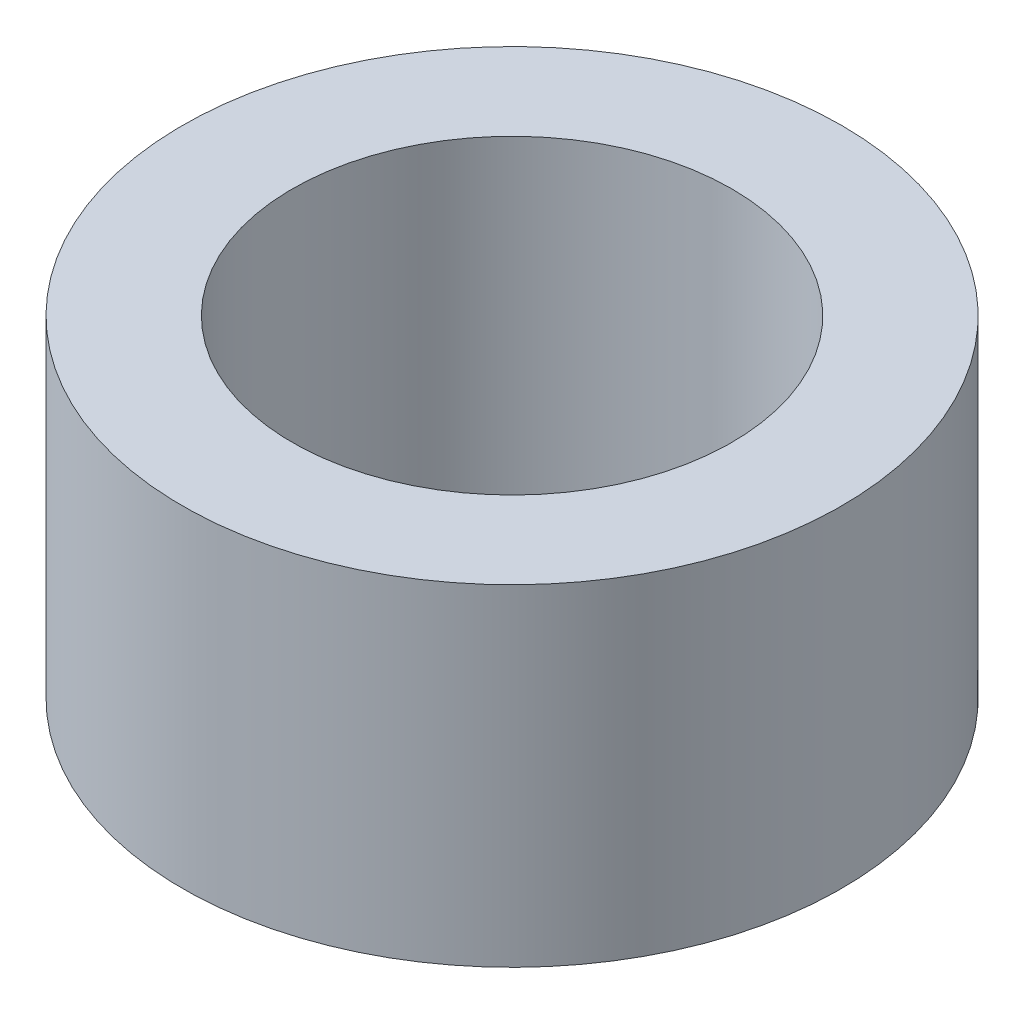
ISO-10303-21;
HEADER;
FILE_DESCRIPTION(('STEP AP214'),'2;1');
FILE_NAME('part.step','',(''),(''),'','','');
FILE_SCHEMA(('AUTOMOTIVE_DESIGN { 1 0 10303 214 1 1 1 1 }'));
ENDSEC;
DATA;
#1=APPLICATION_CONTEXT('core data for automotive mechanical design processes');
#2=APPLICATION_PROTOCOL_DEFINITION('international standard','automotive_design',2000,#1);
#3=PRODUCT_CONTEXT('',#1,'mechanical');
#4=PRODUCT('Part','Part','',(#3));
#5=PRODUCT_RELATED_PRODUCT_CATEGORY('part','',(#4));
#6=PRODUCT_DEFINITION_FORMATION('','',#4);
#7=PRODUCT_DEFINITION_CONTEXT('part definition',#1,'design');
#8=PRODUCT_DEFINITION('design','',#6,#7);
#9=PRODUCT_DEFINITION_SHAPE('','',#8);
#10=(LENGTH_UNIT() NAMED_UNIT(*) SI_UNIT(.MILLI.,.METRE.));
#11=(NAMED_UNIT(*) PLANE_ANGLE_UNIT() SI_UNIT($,.RADIAN.));
#12=(NAMED_UNIT(*) SI_UNIT($,.STERADIAN.) SOLID_ANGLE_UNIT());
#13=UNCERTAINTY_MEASURE_WITH_UNIT(LENGTH_MEASURE(1.E-05),#10,'distance_accuracy_value','');
#14=(GEOMETRIC_REPRESENTATION_CONTEXT(3) GLOBAL_UNCERTAINTY_ASSIGNED_CONTEXT((#13)) GLOBAL_UNIT_ASSIGNED_CONTEXT((#10,
#11,#12)) REPRESENTATION_CONTEXT('',''));
#15=CARTESIAN_POINT('',(0.,0.,0.));
#16=DIRECTION('',(0.,0.,1.));
#17=DIRECTION('',(1.,0.,0.));
#18=AXIS2_PLACEMENT_3D('',#15,#16,#17);
#19=CARTESIAN_POINT('',(0.,6.0325,0.));
#20=DIRECTION('',(0.,1.,0.));
#21=DIRECTION('',(0.,0.,1.));
#22=AXIS2_PLACEMENT_3D('',#19,#20,#21);
#23=PLANE('',#22);
#24=CARTESIAN_POINT('',(0.,6.0325,0.));
#25=DIRECTION('',(0.,1.,0.));
#26=DIRECTION('',(0.,0.,1.));
#27=AXIS2_PLACEMENT_3D('',#24,#25,#26);
#28=CIRCLE('',#27,6.);
#29=CARTESIAN_POINT('',(0.,6.0325,-6.));
#30=VERTEX_POINT('',#29);
#31=EDGE_CURVE('E10',#30,#30,#28,.T.);
#32=ORIENTED_EDGE('',*,*,#31,.T.);
#33=EDGE_LOOP('',(#32));
#34=FACE_BOUND('',#33,.T.);
#35=CARTESIAN_POINT('',(0.,6.0325,0.));
#36=DIRECTION('',(0.,1.,0.));
#37=DIRECTION('',(0.,0.,1.));
#38=AXIS2_PLACEMENT_3D('',#35,#36,#37);
#39=CIRCLE('',#38,4.);
#40=CARTESIAN_POINT('',(0.,6.0325,-4.));
#41=VERTEX_POINT('',#40);
#42=EDGE_CURVE('E42',#41,#41,#39,.T.);
#43=ORIENTED_EDGE('',*,*,#42,.F.);
#44=EDGE_LOOP('',(#43));
#45=FACE_BOUND('',#44,.T.);
#46=ADVANCED_FACE('F31',(#34,#45),#23,.T.);
#47=CARTESIAN_POINT('',(0.,0.,0.));
#48=DIRECTION('',(0.,1.,0.));
#49=DIRECTION('',(0.,0.,1.));
#50=AXIS2_PLACEMENT_3D('',#47,#48,#49);
#51=PLANE('',#50);
#52=CARTESIAN_POINT('',(0.,0.,0.));
#53=DIRECTION('',(0.,1.,0.));
#54=DIRECTION('',(0.,0.,1.));
#55=AXIS2_PLACEMENT_3D('',#52,#53,#54);
#56=CIRCLE('',#55,6.);
#57=CARTESIAN_POINT('',(0.,0.,-6.));
#58=VERTEX_POINT('',#57);
#59=EDGE_CURVE('E35',#58,#58,#56,.T.);
#60=ORIENTED_EDGE('',*,*,#59,.F.);
#61=EDGE_LOOP('',(#60));
#62=FACE_BOUND('',#61,.T.);
#63=CARTESIAN_POINT('',(0.,0.,0.));
#64=DIRECTION('',(0.,1.,0.));
#65=DIRECTION('',(0.,0.,1.));
#66=AXIS2_PLACEMENT_3D('',#63,#64,#65);
#67=CIRCLE('',#66,4.);
#68=CARTESIAN_POINT('',(0.,0.,-4.));
#69=VERTEX_POINT('',#68);
#70=EDGE_CURVE('E44',#69,#69,#67,.T.);
#71=ORIENTED_EDGE('',*,*,#70,.T.);
#72=EDGE_LOOP('',(#71));
#73=FACE_BOUND('',#72,.T.);
#74=ADVANCED_FACE('F54',(#62,#73),#51,.F.);
#75=CARTESIAN_POINT('',(0.,6.0325,0.));
#76=DIRECTION('',(0.,-1.,0.));
#77=DIRECTION('',(0.,0.,-1.));
#78=AXIS2_PLACEMENT_3D('',#75,#76,#77);
#79=CYLINDRICAL_SURFACE('',#78,6.);
#80=CARTESIAN_POINT('',(0.,6.0325,-6.));
#81=CARTESIAN_POINT('',(0.,5.96966145833333,-6.));
#82=CARTESIAN_POINT('',(0.,5.90682291666667,-6.));
#83=CARTESIAN_POINT('',(0.,5.78114583333333,-6.));
#84=CARTESIAN_POINT('',(0.,5.71830729166667,-6.));
#85=CARTESIAN_POINT('',(0.,5.59263020833333,-6.));
#86=CARTESIAN_POINT('',(0.,5.52979166666667,-6.));
#87=CARTESIAN_POINT('',(0.,5.40411458333333,-6.));
#88=CARTESIAN_POINT('',(0.,5.34127604166667,-6.));
#89=CARTESIAN_POINT('',(0.,5.21559895833333,-6.));
#90=CARTESIAN_POINT('',(0.,5.15276041666667,-6.));
#91=CARTESIAN_POINT('',(0.,5.02708333333333,-6.));
#92=CARTESIAN_POINT('',(0.,4.96424479166667,-6.));
#93=CARTESIAN_POINT('',(0.,4.83856770833333,-6.));
#94=CARTESIAN_POINT('',(0.,4.77572916666667,-6.));
#95=CARTESIAN_POINT('',(0.,4.65005208333333,-6.));
#96=CARTESIAN_POINT('',(0.,4.58721354166667,-6.));
#97=CARTESIAN_POINT('',(0.,4.46153645833333,-6.));
#98=CARTESIAN_POINT('',(0.,4.39869791666667,-6.));
#99=CARTESIAN_POINT('',(0.,4.27302083333333,-6.));
#100=CARTESIAN_POINT('',(0.,4.21018229166667,-6.));
#101=CARTESIAN_POINT('',(0.,4.08450520833333,-6.));
#102=CARTESIAN_POINT('',(0.,4.02166666666667,-6.));
#103=CARTESIAN_POINT('',(0.,3.89598958333333,-6.));
#104=CARTESIAN_POINT('',(0.,3.83315104166667,-6.));
#105=CARTESIAN_POINT('',(0.,3.70747395833333,-6.));
#106=CARTESIAN_POINT('',(0.,3.64463541666667,-6.));
#107=CARTESIAN_POINT('',(0.,3.51895833333333,-6.));
#108=CARTESIAN_POINT('',(0.,3.45611979166667,-6.));
#109=CARTESIAN_POINT('',(0.,3.33044270833333,-6.));
#110=CARTESIAN_POINT('',(0.,3.26760416666667,-6.));
#111=CARTESIAN_POINT('',(0.,3.14192708333333,-6.));
#112=CARTESIAN_POINT('',(0.,3.07908854166667,-6.));
#113=CARTESIAN_POINT('',(0.,2.95341145833333,-6.));
#114=CARTESIAN_POINT('',(0.,2.89057291666667,-6.));
#115=CARTESIAN_POINT('',(0.,2.76489583333333,-6.));
#116=CARTESIAN_POINT('',(0.,2.70205729166667,-6.));
#117=CARTESIAN_POINT('',(0.,2.57638020833333,-6.));
#118=CARTESIAN_POINT('',(0.,2.51354166666667,-6.));
#119=CARTESIAN_POINT('',(0.,2.38786458333333,-6.));
#120=CARTESIAN_POINT('',(0.,2.32502604166667,-6.));
#121=CARTESIAN_POINT('',(0.,2.19934895833333,-6.));
#122=CARTESIAN_POINT('',(0.,2.13651041666667,-6.));
#123=CARTESIAN_POINT('',(0.,2.01083333333333,-6.));
#124=CARTESIAN_POINT('',(0.,1.94799479166667,-6.));
#125=CARTESIAN_POINT('',(0.,1.82231770833333,-6.));
#126=CARTESIAN_POINT('',(0.,1.75947916666667,-6.));
#127=CARTESIAN_POINT('',(0.,1.63380208333333,-6.));
#128=CARTESIAN_POINT('',(0.,1.57096354166667,-6.));
#129=CARTESIAN_POINT('',(0.,1.44528645833333,-6.));
#130=CARTESIAN_POINT('',(0.,1.38244791666667,-6.));
#131=CARTESIAN_POINT('',(0.,1.25677083333333,-6.));
#132=CARTESIAN_POINT('',(0.,1.19393229166667,-6.));
#133=CARTESIAN_POINT('',(0.,1.06825520833333,-6.));
#134=CARTESIAN_POINT('',(0.,1.00541666666667,-6.));
#135=CARTESIAN_POINT('',(0.,0.879739583333333,-6.));
#136=CARTESIAN_POINT('',(0.,0.816901041666666,-6.));
#137=CARTESIAN_POINT('',(0.,0.691223958333333,-6.));
#138=CARTESIAN_POINT('',(0.,0.628385416666666,-6.));
#139=CARTESIAN_POINT('',(0.,0.502708333333332,-6.));
#140=CARTESIAN_POINT('',(0.,0.439869791666666,-6.));
#141=CARTESIAN_POINT('',(0.,0.314192708333332,-6.));
#142=CARTESIAN_POINT('',(0.,0.251354166666666,-6.));
#143=CARTESIAN_POINT('',(0.,0.125677083333332,-6.));
#144=CARTESIAN_POINT('',(0.,0.0628385416666657,-6.));
#145=CARTESIAN_POINT('',(0.,0.,-6.));
#146=B_SPLINE_CURVE_WITH_KNOTS('',3,(#80,#81,#82,#83,#84,#85,#86,#87,#88,#89,#90,#91,#92,#93,
#94,#95,#96,#97,#98,#99,#100,#101,#102,#103,#104,#105,#106,#107,#108,#109,#110,#111,#112,#113,
#114,#115,#116,#117,#118,#119,#120,#121,#122,#123,#124,#125,#126,#127,#128,#129,#130,#131,#132,
#133,#134,#135,#136,#137,#138,#139,#140,#141,#142,#143,#144,#145),.UNSPECIFIED.,.F.,.F.,(4,2,2,
2,2,2,2,2,2,2,2,2,2,2,2,2,2,2,2,2,2,2,2,2,2,2,2,2,2,2,2,2,4),(0.,0.188515625,0.37703125,
0.565546875,0.7540625,0.942578124999999,1.13109375,1.319609375,1.508125,1.696640625,1.88515625,
2.073671875,2.2621875,2.450703125,2.63921875,2.827734375,3.01625,3.204765625,3.39328125,
3.581796875,3.7703125,3.958828125,4.14734375,4.335859375,4.524375,4.712890625,4.90140625,
5.089921875,5.2784375,5.466953125,5.65546875,5.843984375,6.0325),.UNSPECIFIED.);
#147=EDGE_CURVE('BSEAM33',#30,#58,#146,.T.);
#148=ORIENTED_EDGE('',*,*,#31,.F.);
#149=ORIENTED_EDGE('',*,*,#59,.T.);
#150=ORIENTED_EDGE('',*,*,#147,.T.);
#151=ORIENTED_EDGE('',*,*,#147,.F.);
#152=EDGE_LOOP('',(#148,#150,#149,#151));
#153=FACE_BOUND('',#152,.T.);
#154=ADVANCED_FACE('F33',(#153),#79,.T.);
#155=CARTESIAN_POINT('',(0.,6.0325,0.));
#156=DIRECTION('',(0.,-1.,0.));
#157=DIRECTION('',(0.,0.,-1.));
#158=AXIS2_PLACEMENT_3D('',#155,#156,#157);
#159=CYLINDRICAL_SURFACE('',#158,4.);
#160=CARTESIAN_POINT('',(0.,6.0325,-4.));
#161=CARTESIAN_POINT('',(0.,5.96966145833333,-4.));
#162=CARTESIAN_POINT('',(0.,5.90682291666667,-4.));
#163=CARTESIAN_POINT('',(0.,5.78114583333333,-4.));
#164=CARTESIAN_POINT('',(0.,5.71830729166667,-4.));
#165=CARTESIAN_POINT('',(0.,5.59263020833333,-4.));
#166=CARTESIAN_POINT('',(0.,5.52979166666667,-4.));
#167=CARTESIAN_POINT('',(0.,5.40411458333333,-4.));
#168=CARTESIAN_POINT('',(0.,5.34127604166667,-4.));
#169=CARTESIAN_POINT('',(0.,5.21559895833333,-4.));
#170=CARTESIAN_POINT('',(0.,5.15276041666667,-4.));
#171=CARTESIAN_POINT('',(0.,5.02708333333333,-4.));
#172=CARTESIAN_POINT('',(0.,4.96424479166667,-4.));
#173=CARTESIAN_POINT('',(0.,4.83856770833333,-4.));
#174=CARTESIAN_POINT('',(0.,4.77572916666667,-4.));
#175=CARTESIAN_POINT('',(0.,4.65005208333333,-4.));
#176=CARTESIAN_POINT('',(0.,4.58721354166667,-4.));
#177=CARTESIAN_POINT('',(0.,4.46153645833333,-4.));
#178=CARTESIAN_POINT('',(0.,4.39869791666667,-4.));
#179=CARTESIAN_POINT('',(0.,4.27302083333333,-4.));
#180=CARTESIAN_POINT('',(0.,4.21018229166667,-4.));
#181=CARTESIAN_POINT('',(0.,4.08450520833333,-4.));
#182=CARTESIAN_POINT('',(0.,4.02166666666667,-4.));
#183=CARTESIAN_POINT('',(0.,3.89598958333333,-4.));
#184=CARTESIAN_POINT('',(0.,3.83315104166667,-4.));
#185=CARTESIAN_POINT('',(0.,3.70747395833333,-4.));
#186=CARTESIAN_POINT('',(0.,3.64463541666667,-4.));
#187=CARTESIAN_POINT('',(0.,3.51895833333333,-4.));
#188=CARTESIAN_POINT('',(0.,3.45611979166667,-4.));
#189=CARTESIAN_POINT('',(0.,3.33044270833333,-4.));
#190=CARTESIAN_POINT('',(0.,3.26760416666667,-4.));
#191=CARTESIAN_POINT('',(0.,3.14192708333333,-4.));
#192=CARTESIAN_POINT('',(0.,3.07908854166667,-4.));
#193=CARTESIAN_POINT('',(0.,2.95341145833333,-4.));
#194=CARTESIAN_POINT('',(0.,2.89057291666667,-4.));
#195=CARTESIAN_POINT('',(0.,2.76489583333333,-4.));
#196=CARTESIAN_POINT('',(0.,2.70205729166667,-4.));
#197=CARTESIAN_POINT('',(0.,2.57638020833333,-4.));
#198=CARTESIAN_POINT('',(0.,2.51354166666667,-4.));
#199=CARTESIAN_POINT('',(0.,2.38786458333333,-4.));
#200=CARTESIAN_POINT('',(0.,2.32502604166667,-4.));
#201=CARTESIAN_POINT('',(0.,2.19934895833333,-4.));
#202=CARTESIAN_POINT('',(0.,2.13651041666667,-4.));
#203=CARTESIAN_POINT('',(0.,2.01083333333333,-4.));
#204=CARTESIAN_POINT('',(0.,1.94799479166667,-4.));
#205=CARTESIAN_POINT('',(0.,1.82231770833333,-4.));
#206=CARTESIAN_POINT('',(0.,1.75947916666667,-4.));
#207=CARTESIAN_POINT('',(0.,1.63380208333333,-4.));
#208=CARTESIAN_POINT('',(0.,1.57096354166667,-4.));
#209=CARTESIAN_POINT('',(0.,1.44528645833333,-4.));
#210=CARTESIAN_POINT('',(0.,1.38244791666667,-4.));
#211=CARTESIAN_POINT('',(0.,1.25677083333333,-4.));
#212=CARTESIAN_POINT('',(0.,1.19393229166667,-4.));
#213=CARTESIAN_POINT('',(0.,1.06825520833333,-4.));
#214=CARTESIAN_POINT('',(0.,1.00541666666667,-4.));
#215=CARTESIAN_POINT('',(0.,0.879739583333333,-4.));
#216=CARTESIAN_POINT('',(0.,0.816901041666666,-4.));
#217=CARTESIAN_POINT('',(0.,0.691223958333333,-4.));
#218=CARTESIAN_POINT('',(0.,0.628385416666666,-4.));
#219=CARTESIAN_POINT('',(0.,0.502708333333333,-4.));
#220=CARTESIAN_POINT('',(0.,0.439869791666666,-4.));
#221=CARTESIAN_POINT('',(0.,0.314192708333332,-4.));
#222=CARTESIAN_POINT('',(0.,0.251354166666666,-4.));
#223=CARTESIAN_POINT('',(0.,0.125677083333332,-4.));
#224=CARTESIAN_POINT('',(0.,0.0628385416666657,-4.));
#225=CARTESIAN_POINT('',(0.,0.,-4.));
#226=B_SPLINE_CURVE_WITH_KNOTS('',3,(#160,#161,#162,#163,#164,#165,#166,#167,#168,#169,#170,
#171,#172,#173,#174,#175,#176,#177,#178,#179,#180,#181,#182,#183,#184,#185,#186,#187,#188,#189,
#190,#191,#192,#193,#194,#195,#196,#197,#198,#199,#200,#201,#202,#203,#204,#205,#206,#207,#208,
#209,#210,#211,#212,#213,#214,#215,#216,#217,#218,#219,#220,#221,#222,#223,#224,#225),
.UNSPECIFIED.,.F.,.F.,(4,2,2,2,2,2,2,2,2,2,2,2,2,2,2,2,2,2,2,2,2,2,2,2,2,2,2,2,2,2,2,2,4),(0.,
0.188515625000001,0.377031250000001,0.565546875000001,0.7540625,0.942578125,1.13109375,
1.319609375,1.508125,1.696640625,1.88515625,2.073671875,2.2621875,2.450703125,2.63921875,
2.827734375,3.01625,3.204765625,3.39328125,3.581796875,3.7703125,3.958828125,4.14734375,
4.335859375,4.524375,4.712890625,4.90140625,5.089921875,5.2784375,5.466953125,5.65546875,
5.843984375,6.0325),.UNSPECIFIED.);
#227=EDGE_CURVE('BSEAM50',#41,#69,#226,.T.);
#228=ORIENTED_EDGE('',*,*,#42,.T.);
#229=ORIENTED_EDGE('',*,*,#70,.F.);
#230=ORIENTED_EDGE('',*,*,#227,.T.);
#231=ORIENTED_EDGE('',*,*,#227,.F.);
#232=EDGE_LOOP('',(#228,#230,#229,#231));
#233=FACE_BOUND('',#232,.T.);
#234=ADVANCED_FACE('F50',(#233),#159,.F.);
#235=CLOSED_SHELL('',(#46,#74,#154,#234));
#236=MANIFOLD_SOLID_BREP('B2',#235);
#237=ADVANCED_BREP_SHAPE_REPRESENTATION('',(#18,#236),#14);
#238=SHAPE_DEFINITION_REPRESENTATION(#9,#237);
ENDSEC;
END-ISO-10303-21;
